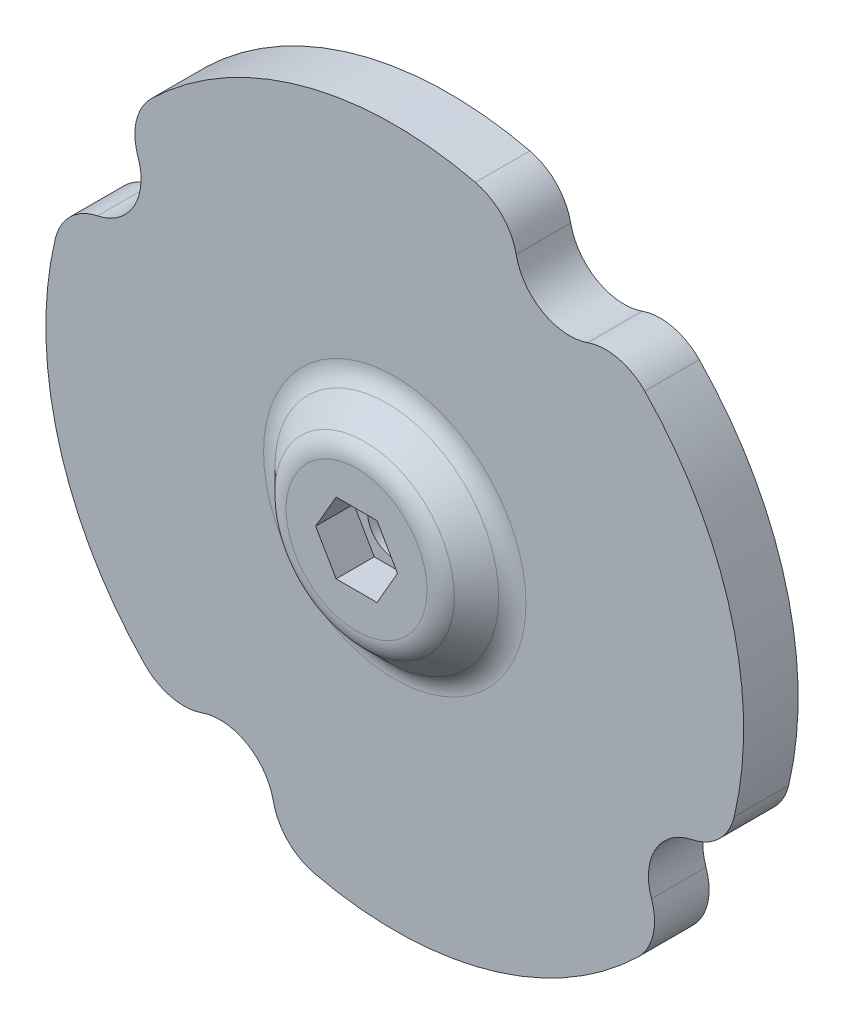
ISO-10303-21;
HEADER;
FILE_DESCRIPTION(('STEP AP214'),'2;1');
FILE_NAME('part.step','',(''),(''),'','','');
FILE_SCHEMA(('AUTOMOTIVE_DESIGN { 1 0 10303 214 1 1 1 1 }'));
ENDSEC;
DATA;
#1=APPLICATION_CONTEXT('core data for automotive mechanical design processes');
#2=APPLICATION_PROTOCOL_DEFINITION('international standard','automotive_design',2000,#1);
#3=PRODUCT_CONTEXT('',#1,'mechanical');
#4=PRODUCT('Part','Part','',(#3));
#5=PRODUCT_RELATED_PRODUCT_CATEGORY('part','',(#4));
#6=PRODUCT_DEFINITION_FORMATION('','',#4);
#7=PRODUCT_DEFINITION_CONTEXT('part definition',#1,'design');
#8=PRODUCT_DEFINITION('design','',#6,#7);
#9=PRODUCT_DEFINITION_SHAPE('','',#8);
#10=(LENGTH_UNIT() NAMED_UNIT(*) SI_UNIT(.MILLI.,.METRE.));
#11=(NAMED_UNIT(*) PLANE_ANGLE_UNIT() SI_UNIT($,.RADIAN.));
#12=(NAMED_UNIT(*) SI_UNIT($,.STERADIAN.) SOLID_ANGLE_UNIT());
#13=UNCERTAINTY_MEASURE_WITH_UNIT(LENGTH_MEASURE(1.E-05),#10,'distance_accuracy_value','');
#14=(GEOMETRIC_REPRESENTATION_CONTEXT(3) GLOBAL_UNCERTAINTY_ASSIGNED_CONTEXT((#13)) GLOBAL_UNIT_ASSIGNED_CONTEXT((#10,
#11,#12)) REPRESENTATION_CONTEXT('',''));
#15=CARTESIAN_POINT('',(0.,0.,0.));
#16=DIRECTION('',(0.,0.,1.));
#17=DIRECTION('',(1.,0.,0.));
#18=AXIS2_PLACEMENT_3D('',#15,#16,#17);
#19=CARTESIAN_POINT('',(0.,0.,10.));
#20=DIRECTION('',(0.,0.,-1.));
#21=DIRECTION('',(-1.,0.,0.));
#22=AXIS2_PLACEMENT_3D('',#19,#20,#21);
#23=CYLINDRICAL_SURFACE('',#22,64.);
#24=CARTESIAN_POINT('',(0.,0.,10.));
#25=DIRECTION('',(0.,0.,1.));
#26=DIRECTION('',(1.,0.,0.));
#27=AXIS2_PLACEMENT_3D('',#24,#25,#26);
#28=CIRCLE('',#27,64.);
#29=CARTESIAN_POINT('',(14.7916212632771,62.2672300685021,10.));
#30=VERTEX_POINT('',#29);
#31=CARTESIAN_POINT('',(-44.6359626370552,45.8653555471165,10.));
#32=VERTEX_POINT('',#31);
#33=EDGE_CURVE('E253',#30,#32,#28,.T.);
#34=ORIENTED_EDGE('',*,*,#33,.F.);
#35=DIRECTION('',(0.,0.,-1.));
#36=VECTOR('',#35,1.);
#37=CARTESIAN_POINT('',(14.7916212632771,62.2672300685021,10.));
#38=LINE('',#37,#36);
#39=CARTESIAN_POINT('',(14.7916212632771,62.2672300685021,0.));
#40=VERTEX_POINT('',#39);
#41=EDGE_CURVE('E324',#30,#40,#38,.T.);
#42=ORIENTED_EDGE('',*,*,#41,.T.);
#43=CARTESIAN_POINT('',(0.,0.,0.));
#44=DIRECTION('',(0.,0.,1.));
#45=DIRECTION('',(1.,0.,0.));
#46=AXIS2_PLACEMENT_3D('',#43,#44,#45);
#47=CIRCLE('',#46,64.);
#48=CARTESIAN_POINT('',(-44.6359626370552,45.8653555471165,0.));
#49=VERTEX_POINT('',#48);
#50=EDGE_CURVE('E262',#40,#49,#47,.T.);
#51=ORIENTED_EDGE('',*,*,#50,.T.);
#52=DIRECTION('',(0.,0.,-1.));
#53=VECTOR('',#52,1.);
#54=CARTESIAN_POINT('',(-44.6359626370552,45.8653555471165,10.));
#55=LINE('',#54,#53);
#56=EDGE_CURVE('E322',#49,#32,#55,.F.);
#57=ORIENTED_EDGE('',*,*,#56,.T.);
#58=EDGE_LOOP('',(#34,#42,#51,#57));
#59=FACE_BOUND('',#58,.T.);
#60=ADVANCED_FACE('F35',(#59),#23,.T.);
#61=CARTESIAN_POINT('',(-62.2672300685495,14.7916212630776,0.));
#62=VERTEX_POINT('',#61);
#63=CARTESIAN_POINT('',(-45.865355546871,-44.6359626373075,0.));
#64=VERTEX_POINT('',#63);
#65=EDGE_CURVE('E379',#62,#64,#47,.T.);
#66=ORIENTED_EDGE('',*,*,#65,.T.);
#67=DIRECTION('',(0.,0.,-1.));
#68=VECTOR('',#67,1.);
#69=CARTESIAN_POINT('',(-45.865355546871,-44.6359626373075,10.));
#70=LINE('',#69,#68);
#71=CARTESIAN_POINT('',(-45.865355546871,-44.6359626373075,10.));
#72=VERTEX_POINT('',#71);
#73=EDGE_CURVE('E305',#64,#72,#70,.F.);
#74=ORIENTED_EDGE('',*,*,#73,.T.);
#75=CARTESIAN_POINT('',(-62.2672300685495,14.7916212630776,10.));
#76=VERTEX_POINT('',#75);
#77=EDGE_CURVE('E256',#76,#72,#28,.T.);
#78=ORIENTED_EDGE('',*,*,#77,.F.);
#79=DIRECTION('',(0.,0.,-1.));
#80=VECTOR('',#79,1.);
#81=CARTESIAN_POINT('',(-62.2672300685495,14.7916212630776,10.));
#82=LINE('',#81,#80);
#83=EDGE_CURVE('E302',#76,#62,#82,.T.);
#84=ORIENTED_EDGE('',*,*,#83,.T.);
#85=EDGE_LOOP('',(#66,#74,#78,#84));
#86=FACE_BOUND('',#85,.T.);
#87=ADVANCED_FACE('F393',(#86),#23,.T.);
#88=CARTESIAN_POINT('',(-14.7916212632945,-62.267230068498,10.));
#89=VERTEX_POINT('',#88);
#90=CARTESIAN_POINT('',(44.6359626371193,-45.8653555470541,10.));
#91=VERTEX_POINT('',#90);
#92=EDGE_CURVE('E258',#89,#91,#28,.T.);
#93=ORIENTED_EDGE('',*,*,#92,.F.);
#94=DIRECTION('',(0.,0.,-1.));
#95=VECTOR('',#94,1.);
#96=CARTESIAN_POINT('',(-14.7916212632945,-62.267230068498,10.));
#97=LINE('',#96,#95);
#98=CARTESIAN_POINT('',(-14.7916212632945,-62.267230068498,0.));
#99=VERTEX_POINT('',#98);
#100=EDGE_CURVE('E265',#89,#99,#97,.T.);
#101=ORIENTED_EDGE('',*,*,#100,.T.);
#102=CARTESIAN_POINT('',(44.6359626371193,-45.8653555470541,0.));
#103=VERTEX_POINT('',#102);
#104=EDGE_CURVE('E261',#99,#103,#47,.T.);
#105=ORIENTED_EDGE('',*,*,#104,.T.);
#106=DIRECTION('',(0.,0.,-1.));
#107=VECTOR('',#106,1.);
#108=CARTESIAN_POINT('',(44.6359626371193,-45.8653555470541,10.));
#109=LINE('',#108,#107);
#110=EDGE_CURVE('E255',#103,#91,#109,.F.);
#111=ORIENTED_EDGE('',*,*,#110,.T.);
#112=EDGE_LOOP('',(#93,#101,#105,#111));
#113=FACE_BOUND('',#112,.T.);
#114=ADVANCED_FACE('F350',(#113),#23,.T.);
#115=CARTESIAN_POINT('',(0.,0.,10.));
#116=DIRECTION('',(0.,0.,1.));
#117=DIRECTION('',(1.,0.,0.));
#118=AXIS2_PLACEMENT_3D('',#115,#116,#117);
#119=PLANE('',#118);
#120=CARTESIAN_POINT('',(0.,0.,10.));
#121=DIRECTION('',(0.,0.,1.));
#122=DIRECTION('',(1.,0.,0.));
#123=AXIS2_PLACEMENT_3D('',#120,#121,#122);
#124=CIRCLE('',#123,24.0710678118655);
#125=CARTESIAN_POINT('',(24.0710678118655,0.,10.));
#126=VERTEX_POINT('',#125);
#127=EDGE_CURVE('E331',#126,#126,#124,.F.);
#128=ORIENTED_EDGE('',*,*,#127,.T.);
#129=EDGE_LOOP('',(#128));
#130=FACE_BOUND('',#129,.T.);
#131=CARTESIAN_POINT('',(-32.077235525319,-56.5336268169897,10.));
#132=DIRECTION('',(0.,0.,1.));
#133=DIRECTION('',(1.,0.,0.));
#134=AXIS2_PLACEMENT_3D('',#131,#132,#133);
#135=CIRCLE('',#134,10.);
#136=CARTESIAN_POINT('',(-35.3880646339957,-47.0976101461089,10.));
#137=VERTEX_POINT('',#136);
#138=CARTESIAN_POINT('',(-22.2788329831119,-54.5358010936424,10.));
#139=VERTEX_POINT('',#138);
#140=EDGE_CURVE('E354',#137,#139,#135,.F.);
#141=ORIENTED_EDGE('',*,*,#140,.T.);
#142=CARTESIAN_POINT('',(-12.4804304409047,-52.5379753702952,10.));
#143=DIRECTION('',(0.,0.,1.));
#144=DIRECTION('',(1.,0.,0.));
#145=AXIS2_PLACEMENT_3D('',#142,#143,#144);
#146=CIRCLE('',#145,10.);
#147=EDGE_CURVE('E300',#139,#89,#146,.T.);
#148=ORIENTED_EDGE('',*,*,#147,.T.);
#149=ORIENTED_EDGE('',*,*,#92,.T.);
#150=CARTESIAN_POINT('',(37.6615934750694,-38.6988937428269,10.));
#151=DIRECTION('',(0.,0.,1.));
#152=DIRECTION('',(1.,0.,0.));
#153=AXIS2_PLACEMENT_3D('',#150,#151,#152);
#154=CIRCLE('',#153,10.);
#155=CARTESIAN_POINT('',(47.0976101459378,-35.3880646341149,10.));
#156=VERTEX_POINT('',#155);
#157=EDGE_CURVE('E296',#91,#156,#154,.T.);
#158=ORIENTED_EDGE('',*,*,#157,.T.);
#159=CARTESIAN_POINT('',(56.5336268168061,-32.077235525403,10.));
#160=DIRECTION('',(0.,0.,1.));
#161=DIRECTION('',(1.,0.,0.));
#162=AXIS2_PLACEMENT_3D('',#159,#160,#161);
#163=CIRCLE('',#162,10.);
#164=CARTESIAN_POINT('',(54.5358010935448,-22.2788329831783,10.));
#165=VERTEX_POINT('',#164);
#166=EDGE_CURVE('E406',#156,#165,#163,.F.);
#167=ORIENTED_EDGE('',*,*,#166,.T.);
#168=CARTESIAN_POINT('',(52.5379753702835,-12.4804304409536,10.));
#169=DIRECTION('',(0.,0.,1.));
#170=DIRECTION('',(1.,0.,0.));
#171=AXIS2_PLACEMENT_3D('',#168,#169,#170);
#172=CIRCLE('',#171,10.);
#173=CARTESIAN_POINT('',(62.2672300684842,-14.7916212633524,10.));
#174=VERTEX_POINT('',#173);
#175=EDGE_CURVE('E294',#165,#174,#172,.T.);
#176=ORIENTED_EDGE('',*,*,#175,.T.);
#177=CARTESIAN_POINT('',(45.865355547182,44.6359626369879,10.));
#178=VERTEX_POINT('',#177);
#179=EDGE_CURVE('E257',#174,#178,#28,.T.);
#180=ORIENTED_EDGE('',*,*,#179,.T.);
#181=CARTESIAN_POINT('',(38.6988937429348,37.6615934749585,10.));
#182=DIRECTION('',(0.,0.,1.));
#183=DIRECTION('',(1.,0.,0.));
#184=AXIS2_PLACEMENT_3D('',#181,#182,#183);
#185=CIRCLE('',#184,10.);
#186=CARTESIAN_POINT('',(35.3880646341548,47.097610145803,10.));
#187=VERTEX_POINT('',#186);
#188=EDGE_CURVE('E292',#178,#187,#185,.T.);
#189=ORIENTED_EDGE('',*,*,#188,.T.);
#190=CARTESIAN_POINT('',(32.0772355253748,56.5336268166475,10.));
#191=DIRECTION('',(0.,0.,1.));
#192=DIRECTION('',(1.,0.,0.));
#193=AXIS2_PLACEMENT_3D('',#190,#191,#192);
#194=CIRCLE('',#193,10.);
#195=CARTESIAN_POINT('',(22.2788329831324,54.5358010934731,10.));
#196=VERTEX_POINT('',#195);
#197=EDGE_CURVE('E411',#187,#196,#194,.F.);
#198=ORIENTED_EDGE('',*,*,#197,.T.);
#199=CARTESIAN_POINT('',(12.48043044089,52.5379753702986,10.));
#200=DIRECTION('',(0.,0.,1.));
#201=DIRECTION('',(1.,0.,0.));
#202=AXIS2_PLACEMENT_3D('',#199,#200,#201);
#203=CIRCLE('',#202,10.);
#204=EDGE_CURVE('E58',#196,#30,#203,.T.);
#205=ORIENTED_EDGE('',*,*,#204,.T.);
#206=ORIENTED_EDGE('',*,*,#33,.T.);
#207=CARTESIAN_POINT('',(-37.6615934750153,38.6988937428795,10.));
#208=DIRECTION('',(0.,0.,1.));
#209=DIRECTION('',(1.,0.,0.));
#210=AXIS2_PLACEMENT_3D('',#207,#208,#209);
#211=CIRCLE('',#210,10.);
#212=CARTESIAN_POINT('',(-47.0976101458408,35.3880646340452,10.));
#213=VERTEX_POINT('',#212);
#214=EDGE_CURVE('E50',#32,#213,#211,.T.);
#215=ORIENTED_EDGE('',*,*,#214,.T.);
#216=CARTESIAN_POINT('',(-56.5336268166662,32.0772355252109,10.));
#217=DIRECTION('',(0.,0.,1.));
#218=DIRECTION('',(1.,0.,0.));
#219=AXIS2_PLACEMENT_3D('',#216,#217,#218);
#220=CIRCLE('',#219,10.);
#221=CARTESIAN_POINT('',(-54.5358010935024,22.2788329829663,10.));
#222=VERTEX_POINT('',#221);
#223=EDGE_CURVE('E227',#213,#222,#220,.F.);
#224=ORIENTED_EDGE('',*,*,#223,.T.);
#225=CARTESIAN_POINT('',(-52.5379753703386,12.4804304407217,10.));
#226=DIRECTION('',(0.,0.,1.));
#227=DIRECTION('',(1.,0.,0.));
#228=AXIS2_PLACEMENT_3D('',#225,#226,#227);
#229=CIRCLE('',#228,10.);
#230=EDGE_CURVE('E289',#222,#76,#229,.T.);
#231=ORIENTED_EDGE('',*,*,#230,.T.);
#232=ORIENTED_EDGE('',*,*,#77,.T.);
#233=CARTESIAN_POINT('',(-38.6988937426724,-37.6615934752282,10.));
#234=DIRECTION('',(0.,0.,1.));
#235=DIRECTION('',(1.,0.,0.));
#236=AXIS2_PLACEMENT_3D('',#233,#234,#235);
#237=CIRCLE('',#236,10.);
#238=EDGE_CURVE('E298',#72,#137,#237,.T.);
#239=ORIENTED_EDGE('',*,*,#238,.T.);
#240=EDGE_LOOP('',(#141,#148,#149,#158,#167,#176,#180,#189,#198,#205,#206,#215,#224,#231,#232,#239));
#241=FACE_BOUND('',#240,.T.);
#242=ADVANCED_FACE('F347',(#130,#241),#119,.T.);
#243=DIRECTION('',(0.5,0.866025403784439,0.));
#244=VECTOR('',#243,1.);
#245=CARTESIAN_POINT('',(3.75277674973258,-6.5,10.));
#246=LINE('',#245,#244);
#247=CARTESIAN_POINT('',(3.75277674973258,-6.5,10.));
#248=VERTEX_POINT('',#247);
#249=CARTESIAN_POINT('',(7.50555349946513,0.,10.));
#250=VERTEX_POINT('',#249);
#251=EDGE_CURVE('E225',#248,#250,#246,.T.);
#252=ORIENTED_EDGE('',*,*,#251,.T.);
#253=DIRECTION('',(-0.5,0.866025403784439,0.));
#254=VECTOR('',#253,1.);
#255=CARTESIAN_POINT('',(7.50555349946513,0.,10.));
#256=LINE('',#255,#254);
#257=CARTESIAN_POINT('',(3.75277674973256,6.5,10.));
#258=VERTEX_POINT('',#257);
#259=EDGE_CURVE('E206',#250,#258,#256,.T.);
#260=ORIENTED_EDGE('',*,*,#259,.T.);
#261=DIRECTION('',(-1.,0.,0.));
#262=VECTOR('',#261,1.);
#263=CARTESIAN_POINT('',(3.75277674973256,6.5,10.));
#264=LINE('',#263,#262);
#265=CARTESIAN_POINT('',(-3.75277674973257,6.5,10.));
#266=VERTEX_POINT('',#265);
#267=EDGE_CURVE('E229',#258,#266,#264,.T.);
#268=ORIENTED_EDGE('',*,*,#267,.T.);
#269=DIRECTION('',(-0.5,-0.866025403784439,0.));
#270=VECTOR('',#269,1.);
#271=CARTESIAN_POINT('',(-3.75277674973257,6.5,10.));
#272=LINE('',#271,#270);
#273=CARTESIAN_POINT('',(-7.50555349946513,0.,10.));
#274=VERTEX_POINT('',#273);
#275=EDGE_CURVE('E231',#266,#274,#272,.T.);
#276=ORIENTED_EDGE('',*,*,#275,.T.);
#277=DIRECTION('',(0.5,-0.866025403784438,0.));
#278=VECTOR('',#277,1.);
#279=CARTESIAN_POINT('',(-7.50555349946513,0.,10.));
#280=LINE('',#279,#278);
#281=CARTESIAN_POINT('',(-3.75277674973257,-6.5,10.));
#282=VERTEX_POINT('',#281);
#283=EDGE_CURVE('E233',#274,#282,#280,.T.);
#284=ORIENTED_EDGE('',*,*,#283,.T.);
#285=DIRECTION('',(1.,0.,0.));
#286=VECTOR('',#285,1.);
#287=CARTESIAN_POINT('',(-3.75277674973257,-6.5,10.));
#288=LINE('',#287,#286);
#289=EDGE_CURVE('E199',#282,#248,#288,.T.);
#290=ORIENTED_EDGE('',*,*,#289,.T.);
#291=EDGE_LOOP('',(#252,#260,#268,#276,#284,#290));
#292=FACE_BOUND('',#291,.T.);
#293=CARTESIAN_POINT('',(0.,0.,10.));
#294=DIRECTION('',(0.,0.,1.));
#295=DIRECTION('',(1.,0.,0.));
#296=AXIS2_PLACEMENT_3D('',#293,#294,#295);
#297=CIRCLE('',#296,5.);
#298=CARTESIAN_POINT('',(5.,0.,10.));
#299=VERTEX_POINT('',#298);
#300=EDGE_CURVE('E247',#299,#299,#297,.T.);
#301=ORIENTED_EDGE('',*,*,#300,.F.);
#302=EDGE_LOOP('',(#301));
#303=FACE_BOUND('',#302,.T.);
#304=ADVANCED_FACE('F349',(#292,#303),#119,.T.);
#305=CARTESIAN_POINT('',(0.,0.,0.));
#306=DIRECTION('',(0.,0.,1.));
#307=DIRECTION('',(1.,0.,0.));
#308=AXIS2_PLACEMENT_3D('',#305,#306,#307);
#309=PLANE('',#308);
#310=ORIENTED_EDGE('',*,*,#104,.F.);
#311=CARTESIAN_POINT('',(-12.4804304409047,-52.5379753702952,0.));
#312=DIRECTION('',(0.,0.,1.));
#313=DIRECTION('',(1.,0.,0.));
#314=AXIS2_PLACEMENT_3D('',#311,#312,#313);
#315=CIRCLE('',#314,10.);
#316=CARTESIAN_POINT('',(-22.2788329831119,-54.5358010936424,0.));
#317=VERTEX_POINT('',#316);
#318=EDGE_CURVE('E282',#99,#317,#315,.F.);
#319=ORIENTED_EDGE('',*,*,#318,.T.);
#320=CARTESIAN_POINT('',(-32.077235525319,-56.5336268169897,0.));
#321=DIRECTION('',(0.,0.,-1.));
#322=DIRECTION('',(-1.,0.,0.));
#323=AXIS2_PLACEMENT_3D('',#320,#321,#322);
#324=CIRCLE('',#323,10.);
#325=CARTESIAN_POINT('',(-35.3880646339957,-47.0976101461089,0.));
#326=VERTEX_POINT('',#325);
#327=EDGE_CURVE('E362',#326,#317,#324,.T.);
#328=ORIENTED_EDGE('',*,*,#327,.F.);
#329=CARTESIAN_POINT('',(-38.6988937426724,-37.6615934752282,0.));
#330=DIRECTION('',(0.,0.,1.));
#331=DIRECTION('',(1.,0.,0.));
#332=AXIS2_PLACEMENT_3D('',#329,#330,#331);
#333=CIRCLE('',#332,10.);
#334=EDGE_CURVE('E280',#326,#64,#333,.F.);
#335=ORIENTED_EDGE('',*,*,#334,.T.);
#336=ORIENTED_EDGE('',*,*,#65,.F.);
#337=CARTESIAN_POINT('',(-52.5379753703386,12.4804304407217,0.));
#338=DIRECTION('',(0.,0.,1.));
#339=DIRECTION('',(1.,0.,0.));
#340=AXIS2_PLACEMENT_3D('',#337,#338,#339);
#341=CIRCLE('',#340,10.);
#342=CARTESIAN_POINT('',(-54.5358010935024,22.2788329829663,0.));
#343=VERTEX_POINT('',#342);
#344=EDGE_CURVE('E270',#62,#343,#341,.F.);
#345=ORIENTED_EDGE('',*,*,#344,.T.);
#346=CARTESIAN_POINT('',(-56.5336268166662,32.0772355252109,0.));
#347=DIRECTION('',(0.,0.,-1.));
#348=DIRECTION('',(-1.,0.,0.));
#349=AXIS2_PLACEMENT_3D('',#346,#347,#348);
#350=CIRCLE('',#349,10.);
#351=CARTESIAN_POINT('',(-47.0976101458408,35.3880646340452,0.));
#352=VERTEX_POINT('',#351);
#353=EDGE_CURVE('E361',#352,#343,#350,.T.);
#354=ORIENTED_EDGE('',*,*,#353,.F.);
#355=CARTESIAN_POINT('',(-37.6615934750153,38.6988937428795,0.));
#356=DIRECTION('',(0.,0.,1.));
#357=DIRECTION('',(1.,0.,0.));
#358=AXIS2_PLACEMENT_3D('',#355,#356,#357);
#359=CIRCLE('',#358,10.);
#360=EDGE_CURVE('E268',#352,#49,#359,.F.);
#361=ORIENTED_EDGE('',*,*,#360,.T.);
#362=ORIENTED_EDGE('',*,*,#50,.F.);
#363=CARTESIAN_POINT('',(12.48043044089,52.5379753702986,0.));
#364=DIRECTION('',(0.,0.,1.));
#365=DIRECTION('',(1.,0.,0.));
#366=AXIS2_PLACEMENT_3D('',#363,#364,#365);
#367=CIRCLE('',#366,10.);
#368=CARTESIAN_POINT('',(22.2788329831324,54.5358010934731,0.));
#369=VERTEX_POINT('',#368);
#370=EDGE_CURVE('E272',#40,#369,#367,.F.);
#371=ORIENTED_EDGE('',*,*,#370,.T.);
#372=CARTESIAN_POINT('',(32.0772355253748,56.5336268166475,0.));
#373=DIRECTION('',(0.,0.,-1.));
#374=DIRECTION('',(-1.,0.,0.));
#375=AXIS2_PLACEMENT_3D('',#372,#373,#374);
#376=CIRCLE('',#375,10.);
#377=CARTESIAN_POINT('',(35.3880646341548,47.097610145803,0.));
#378=VERTEX_POINT('',#377);
#379=EDGE_CURVE('E414',#378,#369,#376,.T.);
#380=ORIENTED_EDGE('',*,*,#379,.F.);
#381=CARTESIAN_POINT('',(38.6988937429348,37.6615934749585,0.));
#382=DIRECTION('',(0.,0.,1.));
#383=DIRECTION('',(1.,0.,0.));
#384=AXIS2_PLACEMENT_3D('',#381,#382,#383);
#385=CIRCLE('',#384,10.);
#386=CARTESIAN_POINT('',(45.865355547182,44.6359626369879,0.));
#387=VERTEX_POINT('',#386);
#388=EDGE_CURVE('E274',#378,#387,#385,.F.);
#389=ORIENTED_EDGE('',*,*,#388,.T.);
#390=CARTESIAN_POINT('',(62.2672300684842,-14.7916212633524,0.));
#391=VERTEX_POINT('',#390);
#392=EDGE_CURVE('E250',#391,#387,#47,.T.);
#393=ORIENTED_EDGE('',*,*,#392,.F.);
#394=CARTESIAN_POINT('',(52.5379753702835,-12.4804304409536,0.));
#395=DIRECTION('',(0.,0.,1.));
#396=DIRECTION('',(1.,0.,0.));
#397=AXIS2_PLACEMENT_3D('',#394,#395,#396);
#398=CIRCLE('',#397,10.);
#399=CARTESIAN_POINT('',(54.5358010935448,-22.2788329831783,0.));
#400=VERTEX_POINT('',#399);
#401=EDGE_CURVE('E276',#391,#400,#398,.F.);
#402=ORIENTED_EDGE('',*,*,#401,.T.);
#403=CARTESIAN_POINT('',(56.5336268168061,-32.077235525403,0.));
#404=DIRECTION('',(0.,0.,-1.));
#405=DIRECTION('',(-1.,0.,0.));
#406=AXIS2_PLACEMENT_3D('',#403,#404,#405);
#407=CIRCLE('',#406,10.);
#408=CARTESIAN_POINT('',(47.0976101459378,-35.3880646341149,0.));
#409=VERTEX_POINT('',#408);
#410=EDGE_CURVE('E408',#409,#400,#407,.T.);
#411=ORIENTED_EDGE('',*,*,#410,.F.);
#412=CARTESIAN_POINT('',(37.6615934750694,-38.6988937428269,0.));
#413=DIRECTION('',(0.,0.,1.));
#414=DIRECTION('',(1.,0.,0.));
#415=AXIS2_PLACEMENT_3D('',#412,#413,#414);
#416=CIRCLE('',#415,10.);
#417=EDGE_CURVE('E278',#409,#103,#416,.F.);
#418=ORIENTED_EDGE('',*,*,#417,.T.);
#419=EDGE_LOOP('',(#310,#319,#328,#335,#336,#345,#354,#361,#362,#371,#380,#389,#393,#402,#411,#418));
#420=FACE_BOUND('',#419,.T.);
#421=CARTESIAN_POINT('',(0.,0.,0.));
#422=DIRECTION('',(0.,0.,1.));
#423=DIRECTION('',(1.,0.,0.));
#424=AXIS2_PLACEMENT_3D('',#421,#422,#423);
#425=CIRCLE('',#424,5.);
#426=CARTESIAN_POINT('',(5.,0.,0.));
#427=VERTEX_POINT('',#426);
#428=EDGE_CURVE('E207',#427,#427,#425,.T.);
#429=ORIENTED_EDGE('',*,*,#428,.T.);
#430=EDGE_LOOP('',(#429));
#431=FACE_BOUND('',#430,.T.);
#432=ADVANCED_FACE('F373',(#420,#431),#309,.F.);
#433=ORIENTED_EDGE('',*,*,#179,.F.);
#434=DIRECTION('',(0.,0.,-1.));
#435=VECTOR('',#434,1.);
#436=CARTESIAN_POINT('',(62.2672300684842,-14.7916212633524,10.));
#437=LINE('',#436,#435);
#438=EDGE_CURVE('E315',#174,#391,#437,.T.);
#439=ORIENTED_EDGE('',*,*,#438,.T.);
#440=ORIENTED_EDGE('',*,*,#392,.T.);
#441=DIRECTION('',(0.,0.,-1.));
#442=VECTOR('',#441,1.);
#443=CARTESIAN_POINT('',(45.865355547182,44.6359626369879,10.));
#444=LINE('',#443,#442);
#445=EDGE_CURVE('E312',#387,#178,#444,.F.);
#446=ORIENTED_EDGE('',*,*,#445,.T.);
#447=EDGE_LOOP('',(#433,#439,#440,#446));
#448=FACE_BOUND('',#447,.T.);
#449=ADVANCED_FACE('F435',(#448),#23,.T.);
#450=CARTESIAN_POINT('',(0.,0.,10.));
#451=DIRECTION('',(0.,0.,-1.));
#452=DIRECTION('',(-1.,0.,0.));
#453=AXIS2_PLACEMENT_3D('',#450,#451,#452);
#454=CYLINDRICAL_SURFACE('',#453,5.);
#455=ORIENTED_EDGE('',*,*,#300,.T.);
#456=EDGE_LOOP('',(#455));
#457=FACE_BOUND('',#456,.T.);
#458=ORIENTED_EDGE('',*,*,#428,.F.);
#459=EDGE_LOOP('',(#458));
#460=FACE_BOUND('',#459,.T.);
#461=ADVANCED_FACE('F442',(#457,#460),#454,.F.);
#462=CARTESIAN_POINT('',(0.,0.,17.));
#463=DIRECTION('',(0.,0.,1.));
#464=DIRECTION('',(1.,0.,0.));
#465=AXIS2_PLACEMENT_3D('',#462,#463,#464);
#466=PLANE('',#465);
#467=CARTESIAN_POINT('',(0.,0.,17.));
#468=DIRECTION('',(0.,0.,1.));
#469=DIRECTION('',(1.,0.,0.));
#470=AXIS2_PLACEMENT_3D('',#467,#468,#469);
#471=CIRCLE('',#470,12.9289321881346);
#472=CARTESIAN_POINT('',(12.9289321881346,0.,17.));
#473=VERTEX_POINT('',#472);
#474=EDGE_CURVE('E11',#473,#473,#471,.T.);
#475=ORIENTED_EDGE('',*,*,#474,.T.);
#476=EDGE_LOOP('',(#475));
#477=FACE_BOUND('',#476,.T.);
#478=DIRECTION('',(-0.5,0.866025403784439,0.));
#479=VECTOR('',#478,1.);
#480=CARTESIAN_POINT('',(7.50555349946513,0.,17.));
#481=LINE('',#480,#479);
#482=CARTESIAN_POINT('',(7.50555349946513,0.,17.));
#483=VERTEX_POINT('',#482);
#484=CARTESIAN_POINT('',(3.75277674973256,6.5,17.));
#485=VERTEX_POINT('',#484);
#486=EDGE_CURVE('E198',#483,#485,#481,.T.);
#487=ORIENTED_EDGE('',*,*,#486,.F.);
#488=DIRECTION('',(0.5,0.866025403784439,0.));
#489=VECTOR('',#488,1.);
#490=CARTESIAN_POINT('',(3.75277674973258,-6.5,17.));
#491=LINE('',#490,#489);
#492=CARTESIAN_POINT('',(3.75277674973258,-6.5,17.));
#493=VERTEX_POINT('',#492);
#494=EDGE_CURVE('E188',#493,#483,#491,.T.);
#495=ORIENTED_EDGE('',*,*,#494,.F.);
#496=DIRECTION('',(1.,0.,0.));
#497=VECTOR('',#496,1.);
#498=CARTESIAN_POINT('',(-3.75277674973257,-6.5,17.));
#499=LINE('',#498,#497);
#500=CARTESIAN_POINT('',(-3.75277674973257,-6.5,17.));
#501=VERTEX_POINT('',#500);
#502=EDGE_CURVE('E223',#501,#493,#499,.T.);
#503=ORIENTED_EDGE('',*,*,#502,.F.);
#504=DIRECTION('',(0.5,-0.866025403784438,0.));
#505=VECTOR('',#504,1.);
#506=CARTESIAN_POINT('',(-7.50555349946513,0.,17.));
#507=LINE('',#506,#505);
#508=CARTESIAN_POINT('',(-7.50555349946513,0.,17.));
#509=VERTEX_POINT('',#508);
#510=EDGE_CURVE('E220',#509,#501,#507,.T.);
#511=ORIENTED_EDGE('',*,*,#510,.F.);
#512=DIRECTION('',(-0.5,-0.866025403784439,0.));
#513=VECTOR('',#512,1.);
#514=CARTESIAN_POINT('',(-3.75277674973257,6.5,17.));
#515=LINE('',#514,#513);
#516=CARTESIAN_POINT('',(-3.75277674973257,6.5,17.));
#517=VERTEX_POINT('',#516);
#518=EDGE_CURVE('E215',#517,#509,#515,.T.);
#519=ORIENTED_EDGE('',*,*,#518,.F.);
#520=DIRECTION('',(-1.,0.,0.));
#521=VECTOR('',#520,1.);
#522=CARTESIAN_POINT('',(3.75277674973256,6.5,17.));
#523=LINE('',#522,#521);
#524=EDGE_CURVE('E213',#485,#517,#523,.T.);
#525=ORIENTED_EDGE('',*,*,#524,.F.);
#526=EDGE_LOOP('',(#487,#495,#503,#511,#519,#525));
#527=FACE_BOUND('',#526,.T.);
#528=ADVANCED_FACE('F211',(#477,#527),#466,.T.);
#529=CARTESIAN_POINT('',(3.75277674973258,-6.5,17.));
#530=DIRECTION('',(-0.866025403784439,0.5,0.));
#531=DIRECTION('',(-0.5,-0.866025403784439,0.));
#532=AXIS2_PLACEMENT_3D('',#529,#530,#531);
#533=PLANE('',#532);
#534=ORIENTED_EDGE('',*,*,#251,.F.);
#535=DIRECTION('',(0.,0.,-1.));
#536=VECTOR('',#535,1.);
#537=CARTESIAN_POINT('',(3.75277674973258,-6.5,17.));
#538=LINE('',#537,#536);
#539=EDGE_CURVE('E194',#493,#248,#538,.T.);
#540=ORIENTED_EDGE('',*,*,#539,.F.);
#541=ORIENTED_EDGE('',*,*,#494,.T.);
#542=DIRECTION('',(0.,0.,-1.));
#543=VECTOR('',#542,1.);
#544=CARTESIAN_POINT('',(7.50555349946513,0.,17.));
#545=LINE('',#544,#543);
#546=EDGE_CURVE('E192',#483,#250,#545,.T.);
#547=ORIENTED_EDGE('',*,*,#546,.T.);
#548=EDGE_LOOP('',(#534,#540,#541,#547));
#549=FACE_BOUND('',#548,.T.);
#550=ADVANCED_FACE('F191',(#549),#533,.T.);
#551=CARTESIAN_POINT('',(7.50555349946513,0.,17.));
#552=DIRECTION('',(-0.866025403784439,-0.5,0.));
#553=DIRECTION('',(0.5,-0.866025403784439,0.));
#554=AXIS2_PLACEMENT_3D('',#551,#552,#553);
#555=PLANE('',#554);
#556=ORIENTED_EDGE('',*,*,#259,.F.);
#557=ORIENTED_EDGE('',*,*,#546,.F.);
#558=ORIENTED_EDGE('',*,*,#486,.T.);
#559=DIRECTION('',(0.,0.,-1.));
#560=VECTOR('',#559,1.);
#561=CARTESIAN_POINT('',(3.75277674973256,6.5,17.));
#562=LINE('',#561,#560);
#563=EDGE_CURVE('E208',#485,#258,#562,.T.);
#564=ORIENTED_EDGE('',*,*,#563,.T.);
#565=EDGE_LOOP('',(#556,#557,#558,#564));
#566=FACE_BOUND('',#565,.T.);
#567=ADVANCED_FACE('F203',(#566),#555,.T.);
#568=CARTESIAN_POINT('',(3.75277674973256,6.5,17.));
#569=DIRECTION('',(0.,-1.,0.));
#570=DIRECTION('',(0.,0.,-1.));
#571=AXIS2_PLACEMENT_3D('',#568,#569,#570);
#572=PLANE('',#571);
#573=ORIENTED_EDGE('',*,*,#267,.F.);
#574=ORIENTED_EDGE('',*,*,#563,.F.);
#575=ORIENTED_EDGE('',*,*,#524,.T.);
#576=DIRECTION('',(0.,0.,-1.));
#577=VECTOR('',#576,1.);
#578=CARTESIAN_POINT('',(-3.75277674973257,6.5,17.));
#579=LINE('',#578,#577);
#580=EDGE_CURVE('E243',#517,#266,#579,.T.);
#581=ORIENTED_EDGE('',*,*,#580,.T.);
#582=EDGE_LOOP('',(#573,#574,#575,#581));
#583=FACE_BOUND('',#582,.T.);
#584=ADVANCED_FACE('F617',(#583),#572,.T.);
#585=CARTESIAN_POINT('',(-3.75277674973257,6.5,17.));
#586=DIRECTION('',(0.866025403784439,-0.5,0.));
#587=DIRECTION('',(0.5,0.866025403784439,0.));
#588=AXIS2_PLACEMENT_3D('',#585,#586,#587);
#589=PLANE('',#588);
#590=ORIENTED_EDGE('',*,*,#275,.F.);
#591=ORIENTED_EDGE('',*,*,#580,.F.);
#592=ORIENTED_EDGE('',*,*,#518,.T.);
#593=DIRECTION('',(0.,0.,-1.));
#594=VECTOR('',#593,1.);
#595=CARTESIAN_POINT('',(-7.50555349946513,0.,17.));
#596=LINE('',#595,#594);
#597=EDGE_CURVE('E240',#509,#274,#596,.T.);
#598=ORIENTED_EDGE('',*,*,#597,.T.);
#599=EDGE_LOOP('',(#590,#591,#592,#598));
#600=FACE_BOUND('',#599,.T.);
#601=ADVANCED_FACE('F620',(#600),#589,.T.);
#602=CARTESIAN_POINT('',(-7.50555349946513,0.,17.));
#603=DIRECTION('',(0.866025403784438,0.5,0.));
#604=DIRECTION('',(-0.5,0.866025403784439,0.));
#605=AXIS2_PLACEMENT_3D('',#602,#603,#604);
#606=PLANE('',#605);
#607=ORIENTED_EDGE('',*,*,#283,.F.);
#608=ORIENTED_EDGE('',*,*,#597,.F.);
#609=ORIENTED_EDGE('',*,*,#510,.T.);
#610=DIRECTION('',(0.,0.,-1.));
#611=VECTOR('',#610,1.);
#612=CARTESIAN_POINT('',(-3.75277674973257,-6.5,17.));
#613=LINE('',#612,#611);
#614=EDGE_CURVE('E237',#501,#282,#613,.T.);
#615=ORIENTED_EDGE('',*,*,#614,.T.);
#616=EDGE_LOOP('',(#607,#608,#609,#615));
#617=FACE_BOUND('',#616,.T.);
#618=ADVANCED_FACE('F624',(#617),#606,.T.);
#619=CARTESIAN_POINT('',(-3.75277674973257,-6.5,17.));
#620=DIRECTION('',(0.,1.,0.));
#621=DIRECTION('',(-1.,0.,0.));
#622=AXIS2_PLACEMENT_3D('',#619,#620,#621);
#623=PLANE('',#622);
#624=ORIENTED_EDGE('',*,*,#289,.F.);
#625=ORIENTED_EDGE('',*,*,#614,.F.);
#626=ORIENTED_EDGE('',*,*,#502,.T.);
#627=ORIENTED_EDGE('',*,*,#539,.T.);
#628=EDGE_LOOP('',(#624,#625,#626,#627));
#629=FACE_BOUND('',#628,.T.);
#630=ADVANCED_FACE('F488',(#629),#623,.T.);
#631=CARTESIAN_POINT('',(32.0772355253748,56.5336268166475,38.2842712474619));
#632=DIRECTION('',(0.,0.,-1.));
#633=DIRECTION('',(-1.,0.,0.));
#634=AXIS2_PLACEMENT_3D('',#631,#632,#633);
#635=CYLINDRICAL_SURFACE('',#634,10.);
#636=ORIENTED_EDGE('',*,*,#197,.F.);
#637=DIRECTION('',(0.,0.,-1.));
#638=VECTOR('',#637,1.);
#639=CARTESIAN_POINT('',(35.3880646341548,47.097610145803,38.2842712474619));
#640=LINE('',#639,#638);
#641=EDGE_CURVE('E320',#187,#378,#640,.T.);
#642=ORIENTED_EDGE('',*,*,#641,.T.);
#643=ORIENTED_EDGE('',*,*,#379,.T.);
#644=DIRECTION('',(0.,0.,-1.));
#645=VECTOR('',#644,1.);
#646=CARTESIAN_POINT('',(22.2788329831324,54.5358010934731,38.2842712474619));
#647=LINE('',#646,#645);
#648=EDGE_CURVE('E318',#369,#196,#647,.F.);
#649=ORIENTED_EDGE('',*,*,#648,.T.);
#650=EDGE_LOOP('',(#636,#642,#643,#649));
#651=FACE_BOUND('',#650,.T.);
#652=ADVANCED_FACE('F482',(#651),#635,.F.);
#653=CARTESIAN_POINT('',(56.5336268168061,-32.077235525403,38.2842712474619));
#654=DIRECTION('',(0.,0.,-1.));
#655=DIRECTION('',(-1.,0.,0.));
#656=AXIS2_PLACEMENT_3D('',#653,#654,#655);
#657=CYLINDRICAL_SURFACE('',#656,10.);
#658=ORIENTED_EDGE('',*,*,#166,.F.);
#659=DIRECTION('',(0.,0.,-1.));
#660=VECTOR('',#659,1.);
#661=CARTESIAN_POINT('',(47.0976101459378,-35.3880646341149,38.2842712474619));
#662=LINE('',#661,#660);
#663=EDGE_CURVE('E310',#156,#409,#662,.T.);
#664=ORIENTED_EDGE('',*,*,#663,.T.);
#665=ORIENTED_EDGE('',*,*,#410,.T.);
#666=DIRECTION('',(0.,0.,-1.));
#667=VECTOR('',#666,1.);
#668=CARTESIAN_POINT('',(54.5358010935448,-22.2788329831783,38.2842712474619));
#669=LINE('',#668,#667);
#670=EDGE_CURVE('E308',#400,#165,#669,.F.);
#671=ORIENTED_EDGE('',*,*,#670,.T.);
#672=EDGE_LOOP('',(#658,#664,#665,#671));
#673=FACE_BOUND('',#672,.T.);
#674=ADVANCED_FACE('F487',(#673),#657,.F.);
#675=CARTESIAN_POINT('',(-32.077235525319,-56.5336268169897,38.2842712474619));
#676=DIRECTION('',(0.,0.,-1.));
#677=DIRECTION('',(-1.,0.,0.));
#678=AXIS2_PLACEMENT_3D('',#675,#676,#677);
#679=CYLINDRICAL_SURFACE('',#678,10.);
#680=ORIENTED_EDGE('',*,*,#327,.T.);
#681=DIRECTION('',(0.,0.,-1.));
#682=VECTOR('',#681,1.);
#683=CARTESIAN_POINT('',(-22.2788329831119,-54.5358010936424,38.2842712474619));
#684=LINE('',#683,#682);
#685=EDGE_CURVE('E286',#317,#139,#684,.F.);
#686=ORIENTED_EDGE('',*,*,#685,.T.);
#687=ORIENTED_EDGE('',*,*,#140,.F.);
#688=DIRECTION('',(0.,0.,-1.));
#689=VECTOR('',#688,1.);
#690=CARTESIAN_POINT('',(-35.3880646339957,-47.0976101461089,38.2842712474619));
#691=LINE('',#690,#689);
#692=EDGE_CURVE('E284',#137,#326,#691,.T.);
#693=ORIENTED_EDGE('',*,*,#692,.T.);
#694=EDGE_LOOP('',(#680,#686,#687,#693));
#695=FACE_BOUND('',#694,.T.);
#696=ADVANCED_FACE('F499',(#695),#679,.F.);
#697=CARTESIAN_POINT('',(-56.5336268166662,32.0772355252109,38.2842712474619));
#698=DIRECTION('',(0.,0.,-1.));
#699=DIRECTION('',(-1.,0.,0.));
#700=AXIS2_PLACEMENT_3D('',#697,#698,#699);
#701=CYLINDRICAL_SURFACE('',#700,10.);
#702=ORIENTED_EDGE('',*,*,#353,.T.);
#703=DIRECTION('',(0.,0.,-1.));
#704=VECTOR('',#703,1.);
#705=CARTESIAN_POINT('',(-54.5358010935024,22.2788329829663,38.2842712474619));
#706=LINE('',#705,#704);
#707=EDGE_CURVE('E329',#343,#222,#706,.F.);
#708=ORIENTED_EDGE('',*,*,#707,.T.);
#709=ORIENTED_EDGE('',*,*,#223,.F.);
#710=DIRECTION('',(0.,0.,-1.));
#711=VECTOR('',#710,1.);
#712=CARTESIAN_POINT('',(-47.0976101458408,35.3880646340452,38.2842712474619));
#713=LINE('',#712,#711);
#714=EDGE_CURVE('E327',#213,#352,#713,.T.);
#715=ORIENTED_EDGE('',*,*,#714,.T.);
#716=EDGE_LOOP('',(#702,#708,#709,#715));
#717=FACE_BOUND('',#716,.T.);
#718=ADVANCED_FACE('F401',(#717),#701,.F.);
#719=CARTESIAN_POINT('',(-12.4804304409047,-52.5379753702952,38.2842712474619));
#720=DIRECTION('',(0.,0.,1.));
#721=DIRECTION('',(1.,0.,0.));
#722=AXIS2_PLACEMENT_3D('',#719,#720,#721);
#723=CYLINDRICAL_SURFACE('',#722,10.);
#724=ORIENTED_EDGE('',*,*,#147,.F.);
#725=ORIENTED_EDGE('',*,*,#685,.F.);
#726=ORIENTED_EDGE('',*,*,#318,.F.);
#727=ORIENTED_EDGE('',*,*,#100,.F.);
#728=EDGE_LOOP('',(#724,#725,#726,#727));
#729=FACE_BOUND('',#728,.T.);
#730=ADVANCED_FACE('F367',(#729),#723,.T.);
#731=CARTESIAN_POINT('',(-38.6988937426724,-37.6615934752282,38.2842712474619));
#732=DIRECTION('',(0.,0.,-1.));
#733=DIRECTION('',(-1.,0.,0.));
#734=AXIS2_PLACEMENT_3D('',#731,#732,#733);
#735=CYLINDRICAL_SURFACE('',#734,10.);
#736=ORIENTED_EDGE('',*,*,#334,.F.);
#737=ORIENTED_EDGE('',*,*,#692,.F.);
#738=ORIENTED_EDGE('',*,*,#238,.F.);
#739=ORIENTED_EDGE('',*,*,#73,.F.);
#740=EDGE_LOOP('',(#736,#737,#738,#739));
#741=FACE_BOUND('',#740,.T.);
#742=ADVANCED_FACE('F525',(#741),#735,.T.);
#743=CARTESIAN_POINT('',(37.6615934750694,-38.6988937428269,38.2842712474619));
#744=DIRECTION('',(0.,0.,-1.));
#745=DIRECTION('',(-1.,0.,0.));
#746=AXIS2_PLACEMENT_3D('',#743,#744,#745);
#747=CYLINDRICAL_SURFACE('',#746,10.);
#748=ORIENTED_EDGE('',*,*,#417,.F.);
#749=ORIENTED_EDGE('',*,*,#663,.F.);
#750=ORIENTED_EDGE('',*,*,#157,.F.);
#751=ORIENTED_EDGE('',*,*,#110,.F.);
#752=EDGE_LOOP('',(#748,#749,#750,#751));
#753=FACE_BOUND('',#752,.T.);
#754=ADVANCED_FACE('F533',(#753),#747,.T.);
#755=CARTESIAN_POINT('',(52.5379753702835,-12.4804304409536,38.2842712474619));
#756=DIRECTION('',(0.,0.,1.));
#757=DIRECTION('',(1.,0.,0.));
#758=AXIS2_PLACEMENT_3D('',#755,#756,#757);
#759=CYLINDRICAL_SURFACE('',#758,10.);
#760=ORIENTED_EDGE('',*,*,#175,.F.);
#761=ORIENTED_EDGE('',*,*,#670,.F.);
#762=ORIENTED_EDGE('',*,*,#401,.F.);
#763=ORIENTED_EDGE('',*,*,#438,.F.);
#764=EDGE_LOOP('',(#760,#761,#762,#763));
#765=FACE_BOUND('',#764,.T.);
#766=ADVANCED_FACE('F543',(#765),#759,.T.);
#767=CARTESIAN_POINT('',(38.6988937429348,37.6615934749585,38.2842712474619));
#768=DIRECTION('',(0.,0.,-1.));
#769=DIRECTION('',(-1.,0.,0.));
#770=AXIS2_PLACEMENT_3D('',#767,#768,#769);
#771=CYLINDRICAL_SURFACE('',#770,10.);
#772=ORIENTED_EDGE('',*,*,#388,.F.);
#773=ORIENTED_EDGE('',*,*,#641,.F.);
#774=ORIENTED_EDGE('',*,*,#188,.F.);
#775=ORIENTED_EDGE('',*,*,#445,.F.);
#776=EDGE_LOOP('',(#772,#773,#774,#775));
#777=FACE_BOUND('',#776,.T.);
#778=ADVANCED_FACE('F553',(#777),#771,.T.);
#779=CARTESIAN_POINT('',(12.48043044089,52.5379753702986,38.2842712474619));
#780=DIRECTION('',(0.,0.,1.));
#781=DIRECTION('',(1.,0.,0.));
#782=AXIS2_PLACEMENT_3D('',#779,#780,#781);
#783=CYLINDRICAL_SURFACE('',#782,10.);
#784=ORIENTED_EDGE('',*,*,#204,.F.);
#785=ORIENTED_EDGE('',*,*,#648,.F.);
#786=ORIENTED_EDGE('',*,*,#370,.F.);
#787=ORIENTED_EDGE('',*,*,#41,.F.);
#788=EDGE_LOOP('',(#784,#785,#786,#787));
#789=FACE_BOUND('',#788,.T.);
#790=ADVANCED_FACE('F422',(#789),#783,.T.);
#791=CARTESIAN_POINT('',(-52.5379753703386,12.4804304407217,38.2842712474619));
#792=DIRECTION('',(0.,0.,1.));
#793=DIRECTION('',(1.,0.,0.));
#794=AXIS2_PLACEMENT_3D('',#791,#792,#793);
#795=CYLINDRICAL_SURFACE('',#794,10.);
#796=ORIENTED_EDGE('',*,*,#230,.F.);
#797=ORIENTED_EDGE('',*,*,#707,.F.);
#798=ORIENTED_EDGE('',*,*,#344,.F.);
#799=ORIENTED_EDGE('',*,*,#83,.F.);
#800=EDGE_LOOP('',(#796,#797,#798,#799));
#801=FACE_BOUND('',#800,.T.);
#802=ADVANCED_FACE('F395',(#801),#795,.T.);
#803=CARTESIAN_POINT('',(-37.6615934750153,38.6988937428795,38.2842712474619));
#804=DIRECTION('',(0.,0.,-1.));
#805=DIRECTION('',(-1.,0.,0.));
#806=AXIS2_PLACEMENT_3D('',#803,#804,#805);
#807=CYLINDRICAL_SURFACE('',#806,10.);
#808=ORIENTED_EDGE('',*,*,#360,.F.);
#809=ORIENTED_EDGE('',*,*,#714,.F.);
#810=ORIENTED_EDGE('',*,*,#214,.F.);
#811=ORIENTED_EDGE('',*,*,#56,.F.);
#812=EDGE_LOOP('',(#808,#809,#810,#811));
#813=FACE_BOUND('',#812,.T.);
#814=ADVANCED_FACE('F424',(#813),#807,.T.);
#815=CARTESIAN_POINT('',(0.,0.,17.0000000000001));
#816=DIRECTION('',(0.,0.,-1.));
#817=DIRECTION('',(-1.,0.,0.));
#818=AXIS2_PLACEMENT_3D('',#815,#816,#817);
#819=CONICAL_SURFACE('',#818,15.,0.785398163397444);
#820=CARTESIAN_POINT('',(0.,0.,11.4644660940673));
#821=DIRECTION('',(0.,0.,1.));
#822=DIRECTION('',(1.,0.,0.));
#823=AXIS2_PLACEMENT_3D('',#820,#821,#822);
#824=CIRCLE('',#823,20.5355339059327);
#825=CARTESIAN_POINT('',(20.5355339059327,0.,11.4644660940673));
#826=VERTEX_POINT('',#825);
#827=EDGE_CURVE('E43',#826,#826,#824,.T.);
#828=ORIENTED_EDGE('',*,*,#827,.T.);
#829=EDGE_LOOP('',(#828));
#830=FACE_BOUND('',#829,.T.);
#831=CARTESIAN_POINT('',(0.,0.,15.5355339059327));
#832=DIRECTION('',(0.,0.,-1.));
#833=DIRECTION('',(-1.,0.,0.));
#834=AXIS2_PLACEMENT_3D('',#831,#832,#833);
#835=CIRCLE('',#834,16.4644660940673);
#836=CARTESIAN_POINT('',(-16.4644660940673,0.,15.5355339059327));
#837=VERTEX_POINT('',#836);
#838=EDGE_CURVE('E334',#837,#837,#835,.T.);
#839=ORIENTED_EDGE('',*,*,#838,.T.);
#840=EDGE_LOOP('',(#839));
#841=FACE_BOUND('',#840,.T.);
#842=ADVANCED_FACE('F339',(#830,#841),#819,.T.);
#843=CARTESIAN_POINT('',(0.,0.,15.));
#844=DIRECTION('',(0.,0.,1.));
#845=DIRECTION('',(1.,0.,0.));
#846=AXIS2_PLACEMENT_3D('',#843,#844,#845);
#847=TOROIDAL_SURFACE('',#846,24.0710678118655,5.);
#848=ORIENTED_EDGE('',*,*,#827,.F.);
#849=EDGE_LOOP('',(#848));
#850=FACE_BOUND('',#849,.T.);
#851=ORIENTED_EDGE('',*,*,#127,.F.);
#852=EDGE_LOOP('',(#851));
#853=FACE_BOUND('',#852,.T.);
#854=ADVANCED_FACE('F342',(#850,#853),#847,.F.);
#855=CARTESIAN_POINT('',(0.,0.,12.));
#856=DIRECTION('',(0.,0.,1.));
#857=DIRECTION('',(1.,0.,0.));
#858=AXIS2_PLACEMENT_3D('',#855,#856,#857);
#859=TOROIDAL_SURFACE('',#858,12.9289321881346,5.);
#860=ORIENTED_EDGE('',*,*,#838,.F.);
#861=EDGE_LOOP('',(#860));
#862=FACE_BOUND('',#861,.T.);
#863=ORIENTED_EDGE('',*,*,#474,.F.);
#864=EDGE_LOOP('',(#863));
#865=FACE_BOUND('',#864,.T.);
#866=ADVANCED_FACE('F37',(#862,#865),#859,.T.);
#867=CLOSED_SHELL('',(#60,#87,#114,#242,#304,#432,#449,#461,#528,#550,#567,#584,#601,#618,#630,
#652,#674,#696,#718,#730,#742,#754,#766,#778,#790,#802,#814,#842,#854,#866));
#868=MANIFOLD_SOLID_BREP('B2',#867);
#869=ADVANCED_BREP_SHAPE_REPRESENTATION('',(#18,#868),#14);
#870=SHAPE_DEFINITION_REPRESENTATION(#9,#869);
ENDSEC;
END-ISO-10303-21;
